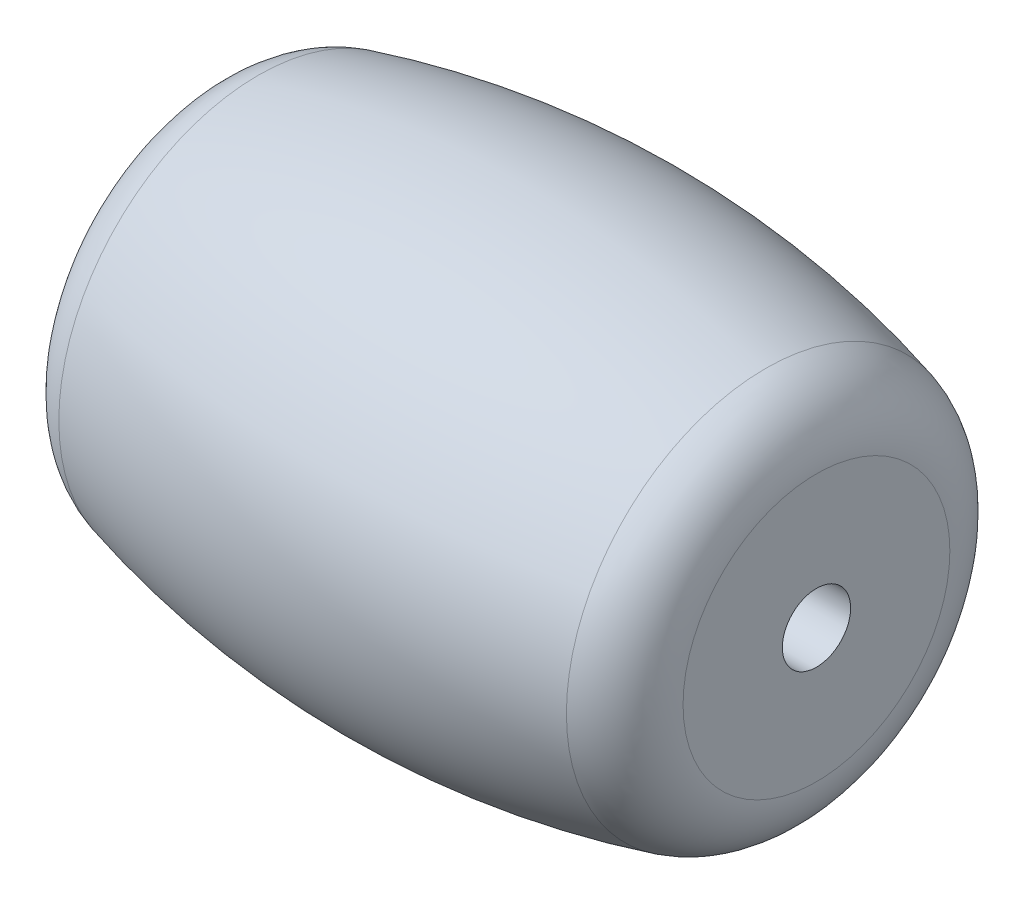
ISO-10303-21;
HEADER;
FILE_DESCRIPTION(('STEP AP214'),'2;1');
FILE_NAME('part.step','',(''),(''),'','','');
FILE_SCHEMA(('AUTOMOTIVE_DESIGN { 1 0 10303 214 1 1 1 1 }'));
ENDSEC;
DATA;
#1=APPLICATION_CONTEXT('core data for automotive mechanical design processes');
#2=APPLICATION_PROTOCOL_DEFINITION('international standard','automotive_design',2000,#1);
#3=PRODUCT_CONTEXT('',#1,'mechanical');
#4=PRODUCT('Part','Part','',(#3));
#5=PRODUCT_RELATED_PRODUCT_CATEGORY('part','',(#4));
#6=PRODUCT_DEFINITION_FORMATION('','',#4);
#7=PRODUCT_DEFINITION_CONTEXT('part definition',#1,'design');
#8=PRODUCT_DEFINITION('design','',#6,#7);
#9=PRODUCT_DEFINITION_SHAPE('','',#8);
#10=(LENGTH_UNIT() NAMED_UNIT(*) SI_UNIT(.MILLI.,.METRE.));
#11=(NAMED_UNIT(*) PLANE_ANGLE_UNIT() SI_UNIT($,.RADIAN.));
#12=(NAMED_UNIT(*) SI_UNIT($,.STERADIAN.) SOLID_ANGLE_UNIT());
#13=UNCERTAINTY_MEASURE_WITH_UNIT(LENGTH_MEASURE(1.E-05),#10,'distance_accuracy_value','');
#14=(GEOMETRIC_REPRESENTATION_CONTEXT(3) GLOBAL_UNCERTAINTY_ASSIGNED_CONTEXT((#13)) GLOBAL_UNIT_ASSIGNED_CONTEXT((#10,
#11,#12)) REPRESENTATION_CONTEXT('',''));
#15=CARTESIAN_POINT('',(0.,0.,0.));
#16=DIRECTION('',(0.,0.,1.));
#17=DIRECTION('',(1.,0.,0.));
#18=AXIS2_PLACEMENT_3D('',#15,#16,#17);
#19=CARTESIAN_POINT('',(13.375,8.1,0.));
#20=DIRECTION('',(1.,0.,0.));
#21=DIRECTION('',(0.,0.,-1.));
#22=AXIS2_PLACEMENT_3D('',#19,#20,#21);
#23=PLANE('',#22);
#24=CARTESIAN_POINT('',(13.375,0.,0.));
#25=DIRECTION('',(1.,0.,0.));
#26=DIRECTION('',(0.,0.,-1.));
#27=AXIS2_PLACEMENT_3D('',#24,#25,#26);
#28=CIRCLE('',#27,1.5);
#29=CARTESIAN_POINT('',(13.375,0.,-1.5));
#30=VERTEX_POINT('',#29);
#31=EDGE_CURVE('E53',#30,#30,#28,.T.);
#32=ORIENTED_EDGE('',*,*,#31,.F.);
#33=EDGE_LOOP('',(#32));
#34=FACE_BOUND('',#33,.T.);
#35=CARTESIAN_POINT('',(13.375,0.,0.));
#36=DIRECTION('',(1.,0.,0.));
#37=DIRECTION('',(0.,0.,-1.));
#38=AXIS2_PLACEMENT_3D('',#35,#36,#37);
#39=CIRCLE('',#38,5.8599099870167);
#40=CARTESIAN_POINT('',(13.375,0.,-5.8599099870167));
#41=VERTEX_POINT('',#40);
#42=EDGE_CURVE('E10',#41,#41,#39,.T.);
#43=ORIENTED_EDGE('',*,*,#42,.T.);
#44=EDGE_LOOP('',(#43));
#45=FACE_BOUND('',#44,.T.);
#46=ADVANCED_FACE('F31',(#34,#45),#23,.T.);
#47=CARTESIAN_POINT('',(0.,0.,0.));
#48=DIRECTION('',(1.,0.,0.));
#49=DIRECTION('',(0.,0.,-1.));
#50=AXIS2_PLACEMENT_3D('',#47,#48,#49);
#51=DEGENERATE_TOROIDAL_SURFACE('',#50,33.0311851415095,43.2511851415095,.F.);
#52=CARTESIAN_POINT('',(-11.1482691569348,0.,0.));
#53=DIRECTION('',(1.,0.,0.));
#54=DIRECTION('',(0.,0.,-1.));
#55=AXIS2_PLACEMENT_3D('',#52,#53,#54);
#56=CIRCLE('',#55,8.75853980314249);
#57=CARTESIAN_POINT('',(-11.1482691569348,0.,-8.75853980314249));
#58=VERTEX_POINT('',#57);
#59=EDGE_CURVE('E41',#58,#58,#56,.T.);
#60=ORIENTED_EDGE('',*,*,#59,.T.);
#61=EDGE_LOOP('',(#60));
#62=FACE_BOUND('',#61,.T.);
#63=CARTESIAN_POINT('',(11.1482691569348,0.,0.));
#64=DIRECTION('',(-1.,0.,0.));
#65=DIRECTION('',(0.,0.,1.));
#66=AXIS2_PLACEMENT_3D('',#63,#64,#65);
#67=CIRCLE('',#66,8.75853980314249);
#68=CARTESIAN_POINT('',(11.1482691569348,0.,8.75853980314249));
#69=VERTEX_POINT('',#68);
#70=EDGE_CURVE('E45',#69,#69,#67,.T.);
#71=ORIENTED_EDGE('',*,*,#70,.T.);
#72=EDGE_LOOP('',(#71));
#73=FACE_BOUND('',#72,.T.);
#74=ADVANCED_FACE('F60',(#62,#73),#51,.F.);
#75=CARTESIAN_POINT('',(-13.375,0.,0.));
#76=DIRECTION('',(-1.,0.,0.));
#77=DIRECTION('',(0.,0.,1.));
#78=AXIS2_PLACEMENT_3D('',#75,#76,#77);
#79=PLANE('',#78);
#80=CARTESIAN_POINT('',(-13.375,0.,0.));
#81=DIRECTION('',(1.,0.,0.));
#82=DIRECTION('',(0.,0.,-1.));
#83=AXIS2_PLACEMENT_3D('',#80,#81,#82);
#84=CIRCLE('',#83,1.5);
#85=CARTESIAN_POINT('',(-13.375,0.,-1.5));
#86=VERTEX_POINT('',#85);
#87=EDGE_CURVE('E50',#86,#86,#84,.T.);
#88=ORIENTED_EDGE('',*,*,#87,.T.);
#89=EDGE_LOOP('',(#88));
#90=FACE_BOUND('',#89,.T.);
#91=CARTESIAN_POINT('',(-13.375,0.,0.));
#92=DIRECTION('',(-1.,0.,0.));
#93=DIRECTION('',(0.,0.,1.));
#94=AXIS2_PLACEMENT_3D('',#91,#92,#93);
#95=CIRCLE('',#94,5.8599099870167);
#96=CARTESIAN_POINT('',(-13.375,0.,5.8599099870167));
#97=VERTEX_POINT('',#96);
#98=EDGE_CURVE('E37',#97,#97,#95,.T.);
#99=ORIENTED_EDGE('',*,*,#98,.T.);
#100=EDGE_LOOP('',(#99));
#101=FACE_BOUND('',#100,.T.);
#102=ADVANCED_FACE('F64',(#90,#101),#79,.T.);
#103=CARTESIAN_POINT('',(-10.375,0.,0.));
#104=DIRECTION('',(-1.,0.,0.));
#105=DIRECTION('',(0.,0.,1.));
#106=AXIS2_PLACEMENT_3D('',#103,#104,#105);
#107=TOROIDAL_SURFACE('',#106,5.8599099870167,3.);
#108=ORIENTED_EDGE('',*,*,#98,.F.);
#109=EDGE_LOOP('',(#108));
#110=FACE_BOUND('',#109,.T.);
#111=ORIENTED_EDGE('',*,*,#59,.F.);
#112=EDGE_LOOP('',(#111));
#113=FACE_BOUND('',#112,.T.);
#114=ADVANCED_FACE('F69',(#110,#113),#107,.T.);
#115=CARTESIAN_POINT('',(10.375,0.,0.));
#116=DIRECTION('',(1.,0.,0.));
#117=DIRECTION('',(0.,0.,-1.));
#118=AXIS2_PLACEMENT_3D('',#115,#116,#117);
#119=TOROIDAL_SURFACE('',#118,5.8599099870167,3.);
#120=ORIENTED_EDGE('',*,*,#70,.F.);
#121=EDGE_LOOP('',(#120));
#122=FACE_BOUND('',#121,.T.);
#123=ORIENTED_EDGE('',*,*,#42,.F.);
#124=EDGE_LOOP('',(#123));
#125=FACE_BOUND('',#124,.T.);
#126=ADVANCED_FACE('F76',(#122,#125),#119,.T.);
#127=CARTESIAN_POINT('',(-13.375,0.,0.));
#128=DIRECTION('',(1.,0.,0.));
#129=DIRECTION('',(0.,0.,-1.));
#130=AXIS2_PLACEMENT_3D('',#127,#128,#129);
#131=CYLINDRICAL_SURFACE('',#130,1.5);
#132=ORIENTED_EDGE('',*,*,#87,.F.);
#133=EDGE_LOOP('',(#132));
#134=FACE_BOUND('',#133,.T.);
#135=ORIENTED_EDGE('',*,*,#31,.T.);
#136=EDGE_LOOP('',(#135));
#137=FACE_BOUND('',#136,.T.);
#138=ADVANCED_FACE('F57',(#134,#137),#131,.F.);
#139=CLOSED_SHELL('',(#46,#74,#102,#114,#126,#138));
#140=MANIFOLD_SOLID_BREP('B2',#139);
#141=ADVANCED_BREP_SHAPE_REPRESENTATION('',(#18,#140),#14);
#142=SHAPE_DEFINITION_REPRESENTATION(#9,#141);
ENDSEC;
END-ISO-10303-21;
